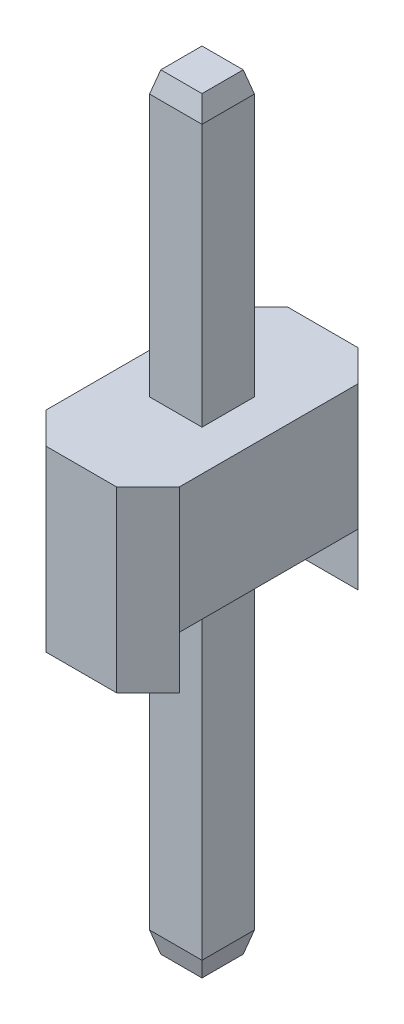
ISO-10303-21;
HEADER;
FILE_DESCRIPTION(('STEP AP214'),'2;1');
FILE_NAME('part.step','',(''),(''),'','','');
FILE_SCHEMA(('AUTOMOTIVE_DESIGN { 1 0 10303 214 1 1 1 1 }'));
ENDSEC;
DATA;
#1=APPLICATION_CONTEXT('core data for automotive mechanical design processes');
#2=APPLICATION_PROTOCOL_DEFINITION('international standard','automotive_design',2000,#1);
#3=PRODUCT_CONTEXT('',#1,'mechanical');
#4=PRODUCT('Part','Part','',(#3));
#5=PRODUCT_RELATED_PRODUCT_CATEGORY('part','',(#4));
#6=PRODUCT_DEFINITION_FORMATION('','',#4);
#7=PRODUCT_DEFINITION_CONTEXT('part definition',#1,'design');
#8=PRODUCT_DEFINITION('design','',#6,#7);
#9=PRODUCT_DEFINITION_SHAPE('','',#8);
#10=(LENGTH_UNIT() NAMED_UNIT(*) SI_UNIT(.MILLI.,.METRE.));
#11=(NAMED_UNIT(*) PLANE_ANGLE_UNIT() SI_UNIT($,.RADIAN.));
#12=(NAMED_UNIT(*) SI_UNIT($,.STERADIAN.) SOLID_ANGLE_UNIT());
#13=UNCERTAINTY_MEASURE_WITH_UNIT(LENGTH_MEASURE(1.E-05),#10,'distance_accuracy_value','');
#14=(GEOMETRIC_REPRESENTATION_CONTEXT(3) GLOBAL_UNCERTAINTY_ASSIGNED_CONTEXT((#13)) GLOBAL_UNIT_ASSIGNED_CONTEXT((#10,
#11,#12)) REPRESENTATION_CONTEXT('',''));
#15=CARTESIAN_POINT('',(0.,0.,0.));
#16=DIRECTION('',(0.,0.,1.));
#17=DIRECTION('',(1.,0.,0.));
#18=AXIS2_PLACEMENT_3D('',#15,#16,#17);
#19=CARTESIAN_POINT('',(0.25,-2.7,0.25));
#20=DIRECTION('',(0.,0.258819045102985,-0.965925826288944));
#21=DIRECTION('',(0.,0.965925826288944,0.258819045102985));
#22=AXIS2_PLACEMENT_3D('',#19,#20,#21);
#23=PLANE('',#22);
#24=DIRECTION('',(-1.,0.,0.));
#25=VECTOR('',#24,1.);
#26=CARTESIAN_POINT('',(0.25,-2.7,0.25));
#27=LINE('',#26,#25);
#28=CARTESIAN_POINT('',(0.25,-2.7,0.25));
#29=VERTEX_POINT('',#28);
#30=CARTESIAN_POINT('',(-0.25,-2.7,0.25));
#31=VERTEX_POINT('',#30);
#32=EDGE_CURVE('E168',#29,#31,#27,.T.);
#33=ORIENTED_EDGE('',*,*,#32,.T.);
#34=DIRECTION('',(0.250562807086243,-0.935113126531138,-0.250562807084814));
#35=VECTOR('',#34,1.);
#36=CARTESIAN_POINT('',(-0.25,-2.7,0.25));
#37=LINE('',#36,#35);
#38=CARTESIAN_POINT('',(-0.196410161513847,-2.89999999999994,0.196410161513924));
#39=VERTEX_POINT('',#38);
#40=EDGE_CURVE('E20',#31,#39,#37,.T.);
#41=ORIENTED_EDGE('',*,*,#40,.T.);
#42=DIRECTION('',(1.,0.,0.));
#43=VECTOR('',#42,1.);
#44=CARTESIAN_POINT('',(0.,-2.9,0.196410161514));
#45=LINE('',#44,#43);
#46=CARTESIAN_POINT('',(0.196410161513924,-2.89999999999996,0.196410161513924));
#47=VERTEX_POINT('',#46);
#48=EDGE_CURVE('E165',#39,#47,#45,.T.);
#49=ORIENTED_EDGE('',*,*,#48,.T.);
#50=DIRECTION('',(0.250562807086243,0.935113126531138,0.250562807084814));
#51=VECTOR('',#50,1.);
#52=CARTESIAN_POINT('',(0.196410161513694,-2.89999999999992,0.196410161514));
#53=LINE('',#52,#51);
#54=EDGE_CURVE('E186',#47,#29,#53,.T.);
#55=ORIENTED_EDGE('',*,*,#54,.T.);
#56=EDGE_LOOP('',(#33,#41,#49,#55));
#57=FACE_BOUND('',#56,.T.);
#58=ADVANCED_FACE('F17',(#57),#23,.F.);
#59=CARTESIAN_POINT('',(-0.25,-2.7,0.25));
#60=DIRECTION('',(0.965925826288944,0.258819045102985,0.));
#61=DIRECTION('',(-0.258819045102985,0.965925826288944,0.));
#62=AXIS2_PLACEMENT_3D('',#59,#60,#61);
#63=PLANE('',#62);
#64=DIRECTION('',(0.,0.,1.));
#65=VECTOR('',#64,1.);
#66=CARTESIAN_POINT('',(-0.196410161514,-2.9,0.));
#67=LINE('',#66,#65);
#68=CARTESIAN_POINT('',(-0.196410161513847,-2.89999999999994,-0.196410161513924));
#69=VERTEX_POINT('',#68);
#70=EDGE_CURVE('E173',#69,#39,#67,.T.);
#71=ORIENTED_EDGE('',*,*,#70,.T.);
#72=ORIENTED_EDGE('',*,*,#40,.F.);
#73=DIRECTION('',(0.,0.,-1.));
#74=VECTOR('',#73,1.);
#75=CARTESIAN_POINT('',(-0.25,-2.7,0.25));
#76=LINE('',#75,#74);
#77=CARTESIAN_POINT('',(-0.25,-2.7,-0.25));
#78=VERTEX_POINT('',#77);
#79=EDGE_CURVE('E198',#31,#78,#76,.T.);
#80=ORIENTED_EDGE('',*,*,#79,.T.);
#81=DIRECTION('',(0.250562807084814,-0.935113126531138,0.250562807086243));
#82=VECTOR('',#81,1.);
#83=CARTESIAN_POINT('',(-0.25,-2.7,-0.25));
#84=LINE('',#83,#82);
#85=EDGE_CURVE('E183',#78,#69,#84,.T.);
#86=ORIENTED_EDGE('',*,*,#85,.T.);
#87=EDGE_LOOP('',(#71,#72,#80,#86));
#88=FACE_BOUND('',#87,.T.);
#89=ADVANCED_FACE('F182',(#88),#63,.F.);
#90=CARTESIAN_POINT('',(0.,-2.9,0.));
#91=DIRECTION('',(0.,1.,0.));
#92=DIRECTION('',(0.,0.,1.));
#93=AXIS2_PLACEMENT_3D('',#90,#91,#92);
#94=PLANE('',#93);
#95=ORIENTED_EDGE('',*,*,#70,.F.);
#96=DIRECTION('',(1.,0.,0.));
#97=VECTOR('',#96,1.);
#98=CARTESIAN_POINT('',(0.25,-2.89999999999992,-0.196410161513694));
#99=LINE('',#98,#97);
#100=CARTESIAN_POINT('',(0.196410161513924,-2.89999999999996,-0.196410161513924));
#101=VERTEX_POINT('',#100);
#102=EDGE_CURVE('E201',#69,#101,#99,.T.);
#103=ORIENTED_EDGE('',*,*,#102,.T.);
#104=DIRECTION('',(0.,0.,1.));
#105=VECTOR('',#104,1.);
#106=CARTESIAN_POINT('',(0.196410161513694,-2.89999999999992,0.25));
#107=LINE('',#106,#105);
#108=EDGE_CURVE('E179',#101,#47,#107,.T.);
#109=ORIENTED_EDGE('',*,*,#108,.T.);
#110=ORIENTED_EDGE('',*,*,#48,.F.);
#111=EDGE_LOOP('',(#95,#103,#109,#110));
#112=FACE_BOUND('',#111,.T.);
#113=ADVANCED_FACE('F176',(#112),#94,.F.);
#114=CARTESIAN_POINT('',(0.25,-2.7,0.25));
#115=DIRECTION('',(-0.965925826288944,0.258819045102985,0.));
#116=DIRECTION('',(-0.258819045102985,-0.965925826288944,0.));
#117=AXIS2_PLACEMENT_3D('',#114,#115,#116);
#118=PLANE('',#117);
#119=ORIENTED_EDGE('',*,*,#108,.F.);
#120=DIRECTION('',(0.250562807084814,0.935113126531138,-0.250562807086243));
#121=VECTOR('',#120,1.);
#122=CARTESIAN_POINT('',(0.196410161514,-2.89999999999992,-0.196410161513694));
#123=LINE('',#122,#121);
#124=CARTESIAN_POINT('',(0.25,-2.7,-0.25));
#125=VERTEX_POINT('',#124);
#126=EDGE_CURVE('E203',#101,#125,#123,.T.);
#127=ORIENTED_EDGE('',*,*,#126,.T.);
#128=DIRECTION('',(0.,0.,1.));
#129=VECTOR('',#128,1.);
#130=CARTESIAN_POINT('',(0.25,-2.7,0.25));
#131=LINE('',#130,#129);
#132=EDGE_CURVE('E208',#125,#29,#131,.T.);
#133=ORIENTED_EDGE('',*,*,#132,.T.);
#134=ORIENTED_EDGE('',*,*,#54,.F.);
#135=EDGE_LOOP('',(#119,#127,#133,#134));
#136=FACE_BOUND('',#135,.T.);
#137=ADVANCED_FACE('F684',(#136),#118,.F.);
#138=CARTESIAN_POINT('',(0.25,-10.90710678118,0.25));
#139=DIRECTION('',(0.,0.,-1.));
#140=DIRECTION('',(-1.,0.,0.));
#141=AXIS2_PLACEMENT_3D('',#138,#139,#140);
#142=PLANE('',#141);
#143=ORIENTED_EDGE('',*,*,#32,.F.);
#144=DIRECTION('',(0.,1.,0.));
#145=VECTOR('',#144,1.);
#146=CARTESIAN_POINT('',(0.25,-10.90710678118,0.25));
#147=LINE('',#146,#145);
#148=CARTESIAN_POINT('',(0.25,0.5,0.25));
#149=VERTEX_POINT('',#148);
#150=EDGE_CURVE('E211',#29,#149,#147,.T.);
#151=ORIENTED_EDGE('',*,*,#150,.T.);
#152=DIRECTION('',(-1.,0.,0.));
#153=VECTOR('',#152,1.);
#154=CARTESIAN_POINT('',(0.25,0.5,0.25));
#155=LINE('',#154,#153);
#156=CARTESIAN_POINT('',(-0.25,0.5,0.25));
#157=VERTEX_POINT('',#156);
#158=EDGE_CURVE('E188',#157,#149,#155,.F.);
#159=ORIENTED_EDGE('',*,*,#158,.F.);
#160=DIRECTION('',(0.,1.,0.));
#161=VECTOR('',#160,1.);
#162=CARTESIAN_POINT('',(-0.25,-10.90710678118,0.25));
#163=LINE('',#162,#161);
#164=EDGE_CURVE('E195',#157,#31,#163,.F.);
#165=ORIENTED_EDGE('',*,*,#164,.T.);
#166=EDGE_LOOP('',(#143,#151,#159,#165));
#167=FACE_BOUND('',#166,.T.);
#168=ADVANCED_FACE('F674',(#167),#142,.F.);
#169=CARTESIAN_POINT('',(-0.25,-10.90710678118,0.25));
#170=DIRECTION('',(1.,0.,0.));
#171=DIRECTION('',(0.,0.,-1.));
#172=AXIS2_PLACEMENT_3D('',#169,#170,#171);
#173=PLANE('',#172);
#174=ORIENTED_EDGE('',*,*,#79,.F.);
#175=ORIENTED_EDGE('',*,*,#164,.F.);
#176=DIRECTION('',(0.,0.,-1.));
#177=VECTOR('',#176,1.);
#178=CARTESIAN_POINT('',(-0.25,0.5,0.25));
#179=LINE('',#178,#177);
#180=CARTESIAN_POINT('',(-0.25,0.5,-0.25));
#181=VERTEX_POINT('',#180);
#182=EDGE_CURVE('E192',#181,#157,#179,.F.);
#183=ORIENTED_EDGE('',*,*,#182,.F.);
#184=DIRECTION('',(0.,1.,0.));
#185=VECTOR('',#184,1.);
#186=CARTESIAN_POINT('',(-0.25,-10.90710678118,-0.25));
#187=LINE('',#186,#185);
#188=EDGE_CURVE('E226',#181,#78,#187,.F.);
#189=ORIENTED_EDGE('',*,*,#188,.T.);
#190=EDGE_LOOP('',(#174,#175,#183,#189));
#191=FACE_BOUND('',#190,.T.);
#192=ADVANCED_FACE('F664',(#191),#173,.F.);
#193=CARTESIAN_POINT('',(0.25,-2.7,-0.25));
#194=DIRECTION('',(0.,0.258819045102985,0.965925826288944));
#195=DIRECTION('',(0.,-0.965925826288944,0.258819045102985));
#196=AXIS2_PLACEMENT_3D('',#193,#194,#195);
#197=PLANE('',#196);
#198=ORIENTED_EDGE('',*,*,#102,.F.);
#199=ORIENTED_EDGE('',*,*,#85,.F.);
#200=DIRECTION('',(1.,0.,0.));
#201=VECTOR('',#200,1.);
#202=CARTESIAN_POINT('',(0.25,-2.7,-0.25));
#203=LINE('',#202,#201);
#204=EDGE_CURVE('E229',#78,#125,#203,.T.);
#205=ORIENTED_EDGE('',*,*,#204,.T.);
#206=ORIENTED_EDGE('',*,*,#126,.F.);
#207=EDGE_LOOP('',(#198,#199,#205,#206));
#208=FACE_BOUND('',#207,.T.);
#209=ADVANCED_FACE('F654',(#208),#197,.F.);
#210=CARTESIAN_POINT('',(0.25,-10.90710678118,0.25));
#211=DIRECTION('',(-1.,0.,0.));
#212=DIRECTION('',(0.,0.,1.));
#213=AXIS2_PLACEMENT_3D('',#210,#211,#212);
#214=PLANE('',#213);
#215=ORIENTED_EDGE('',*,*,#132,.F.);
#216=DIRECTION('',(0.,1.,0.));
#217=VECTOR('',#216,1.);
#218=CARTESIAN_POINT('',(0.25,-10.90710678118,-0.25));
#219=LINE('',#218,#217);
#220=CARTESIAN_POINT('',(0.25,0.5,-0.25));
#221=VERTEX_POINT('',#220);
#222=EDGE_CURVE('E232',#125,#221,#219,.T.);
#223=ORIENTED_EDGE('',*,*,#222,.T.);
#224=DIRECTION('',(0.,0.,1.));
#225=VECTOR('',#224,1.);
#226=CARTESIAN_POINT('',(0.25,0.5,0.25));
#227=LINE('',#226,#225);
#228=EDGE_CURVE('E206',#149,#221,#227,.F.);
#229=ORIENTED_EDGE('',*,*,#228,.F.);
#230=ORIENTED_EDGE('',*,*,#150,.F.);
#231=EDGE_LOOP('',(#215,#223,#229,#230));
#232=FACE_BOUND('',#231,.T.);
#233=ADVANCED_FACE('F412',(#232),#214,.F.);
#234=CARTESIAN_POINT('',(-0.196410161514,4.4,0.));
#235=DIRECTION('',(-0.965925826288944,0.258819045102985,0.));
#236=DIRECTION('',(-0.258819045102985,-0.965925826288944,0.));
#237=AXIS2_PLACEMENT_3D('',#234,#235,#236);
#238=PLANE('',#237);
#239=DIRECTION('',(-0.250562807084814,-0.935113126531138,0.250562807086243));
#240=VECTOR('',#239,1.);
#241=CARTESIAN_POINT('',(-0.196410161514,4.4,0.196410161514));
#242=LINE('',#241,#240);
#243=CARTESIAN_POINT('',(-0.196410161514,4.4,0.196410161514));
#244=VERTEX_POINT('',#243);
#245=CARTESIAN_POINT('',(-0.250000000000153,4.20000000000005,0.250000000000038));
#246=VERTEX_POINT('',#245);
#247=EDGE_CURVE('E237',#244,#246,#242,.T.);
#248=ORIENTED_EDGE('',*,*,#247,.F.);
#249=DIRECTION('',(0.,0.,1.));
#250=VECTOR('',#249,1.);
#251=CARTESIAN_POINT('',(-0.196410161514,4.4,0.));
#252=LINE('',#251,#250);
#253=CARTESIAN_POINT('',(-0.196410161514,4.4,-0.196410161514));
#254=VERTEX_POINT('',#253);
#255=EDGE_CURVE('E235',#254,#244,#252,.T.);
#256=ORIENTED_EDGE('',*,*,#255,.F.);
#257=DIRECTION('',(0.250562807084814,0.935113126531138,0.250562807086243));
#258=VECTOR('',#257,1.);
#259=CARTESIAN_POINT('',(-0.25,4.20000000000008,-0.250000000000306));
#260=LINE('',#259,#258);
#261=CARTESIAN_POINT('',(-0.250000000000153,4.20000000000006,-0.250000000000076));
#262=VERTEX_POINT('',#261);
#263=EDGE_CURVE('E242',#262,#254,#260,.T.);
#264=ORIENTED_EDGE('',*,*,#263,.F.);
#265=DIRECTION('',(0.,0.,-1.));
#266=VECTOR('',#265,1.);
#267=CARTESIAN_POINT('',(-0.25,4.2,-0.25));
#268=LINE('',#267,#266);
#269=EDGE_CURVE('E249',#262,#246,#268,.F.);
#270=ORIENTED_EDGE('',*,*,#269,.T.);
#271=EDGE_LOOP('',(#248,#256,#264,#270));
#272=FACE_BOUND('',#271,.T.);
#273=ADVANCED_FACE('F404',(#272),#238,.T.);
#274=CARTESIAN_POINT('',(0.,0.,0.));
#275=DIRECTION('',(0.,-1.,0.));
#276=DIRECTION('',(0.,0.,-1.));
#277=AXIS2_PLACEMENT_3D('',#274,#275,#276);
#278=PLANE('',#277);
#279=DIRECTION('',(1.,0.,0.));
#280=VECTOR('',#279,1.);
#281=CARTESIAN_POINT('',(0.635,0.,-1.15));
#282=LINE('',#281,#280);
#283=CARTESIAN_POINT('',(-0.335,0.,-1.15));
#284=VERTEX_POINT('',#283);
#285=CARTESIAN_POINT('',(0.335,0.,-1.15));
#286=VERTEX_POINT('',#285);
#287=EDGE_CURVE('E216',#284,#286,#282,.T.);
#288=ORIENTED_EDGE('',*,*,#287,.T.);
#289=DIRECTION('',(0.707106781186548,0.,0.707106781186548));
#290=VECTOR('',#289,1.);
#291=CARTESIAN_POINT('',(0.335,0.,-1.15));
#292=LINE('',#291,#290);
#293=CARTESIAN_POINT('',(0.635,0.,-0.85));
#294=VERTEX_POINT('',#293);
#295=EDGE_CURVE('E266',#286,#294,#292,.T.);
#296=ORIENTED_EDGE('',*,*,#295,.T.);
#297=DIRECTION('',(-1.,0.,0.));
#298=VECTOR('',#297,1.);
#299=CARTESIAN_POINT('',(-0.635,0.,-0.85));
#300=LINE('',#299,#298);
#301=CARTESIAN_POINT('',(-0.635,0.,-0.85));
#302=VERTEX_POINT('',#301);
#303=EDGE_CURVE('E222',#294,#302,#300,.T.);
#304=ORIENTED_EDGE('',*,*,#303,.T.);
#305=DIRECTION('',(0.707106781186548,0.,-0.707106781186548));
#306=VECTOR('',#305,1.);
#307=CARTESIAN_POINT('',(-0.635,0.,-0.85));
#308=LINE('',#307,#306);
#309=EDGE_CURVE('E278',#302,#284,#308,.T.);
#310=ORIENTED_EDGE('',*,*,#309,.T.);
#311=EDGE_LOOP('',(#288,#296,#304,#310));
#312=FACE_BOUND('',#311,.T.);
#313=ADVANCED_FACE('F402',(#312),#278,.T.);
#314=CARTESIAN_POINT('',(0.635,1.7,-1.15));
#315=DIRECTION('',(0.,0.,1.));
#316=DIRECTION('',(1.,0.,0.));
#317=AXIS2_PLACEMENT_3D('',#314,#315,#316);
#318=PLANE('',#317);
#319=DIRECTION('',(0.,1.,0.));
#320=VECTOR('',#319,1.);
#321=CARTESIAN_POINT('',(-0.335,1.7,-1.15));
#322=LINE('',#321,#320);
#323=CARTESIAN_POINT('',(-0.335,1.7,-1.15));
#324=VERTEX_POINT('',#323);
#325=EDGE_CURVE('E281',#284,#324,#322,.T.);
#326=ORIENTED_EDGE('',*,*,#325,.T.);
#327=DIRECTION('',(1.,0.,0.));
#328=VECTOR('',#327,1.);
#329=CARTESIAN_POINT('',(0.635,1.7,-1.15));
#330=LINE('',#329,#328);
#331=CARTESIAN_POINT('',(0.335,1.7,-1.15));
#332=VERTEX_POINT('',#331);
#333=EDGE_CURVE('E214',#332,#324,#330,.F.);
#334=ORIENTED_EDGE('',*,*,#333,.F.);
#335=DIRECTION('',(0.,1.,0.));
#336=VECTOR('',#335,1.);
#337=CARTESIAN_POINT('',(0.335,1.7,-1.15));
#338=LINE('',#337,#336);
#339=EDGE_CURVE('E263',#332,#286,#338,.F.);
#340=ORIENTED_EDGE('',*,*,#339,.T.);
#341=ORIENTED_EDGE('',*,*,#287,.F.);
#342=EDGE_LOOP('',(#326,#334,#340,#341));
#343=FACE_BOUND('',#342,.T.);
#344=ADVANCED_FACE('F400',(#343),#318,.F.);
#345=CARTESIAN_POINT('',(0.635,1.7,1.15));
#346=DIRECTION('',(0.,0.,-1.));
#347=DIRECTION('',(-1.,0.,0.));
#348=AXIS2_PLACEMENT_3D('',#345,#346,#347);
#349=PLANE('',#348);
#350=DIRECTION('',(0.,1.,0.));
#351=VECTOR('',#350,1.);
#352=CARTESIAN_POINT('',(0.335,1.7,1.15));
#353=LINE('',#352,#351);
#354=CARTESIAN_POINT('',(0.335,0.,1.15));
#355=VERTEX_POINT('',#354);
#356=CARTESIAN_POINT('',(0.335,1.7,1.15));
#357=VERTEX_POINT('',#356);
#358=EDGE_CURVE('E258',#355,#357,#353,.T.);
#359=ORIENTED_EDGE('',*,*,#358,.T.);
#360=DIRECTION('',(-1.,0.,0.));
#361=VECTOR('',#360,1.);
#362=CARTESIAN_POINT('',(0.635,1.7,1.15));
#363=LINE('',#362,#361);
#364=CARTESIAN_POINT('',(-0.335,1.7,1.15));
#365=VERTEX_POINT('',#364);
#366=EDGE_CURVE('E218',#365,#357,#363,.F.);
#367=ORIENTED_EDGE('',*,*,#366,.F.);
#368=DIRECTION('',(0.,1.,0.));
#369=VECTOR('',#368,1.);
#370=CARTESIAN_POINT('',(-0.335,1.7,1.15));
#371=LINE('',#370,#369);
#372=CARTESIAN_POINT('',(-0.335,0.,1.15));
#373=VERTEX_POINT('',#372);
#374=EDGE_CURVE('E286',#365,#373,#371,.F.);
#375=ORIENTED_EDGE('',*,*,#374,.T.);
#376=DIRECTION('',(1.,0.,0.));
#377=VECTOR('',#376,1.);
#378=CARTESIAN_POINT('',(0.,0.,1.15));
#379=LINE('',#378,#377);
#380=EDGE_CURVE('E220',#355,#373,#379,.F.);
#381=ORIENTED_EDGE('',*,*,#380,.F.);
#382=EDGE_LOOP('',(#359,#367,#375,#381));
#383=FACE_BOUND('',#382,.T.);
#384=ADVANCED_FACE('F384',(#383),#349,.F.);
#385=CARTESIAN_POINT('',(0.,0.,0.));
#386=DIRECTION('',(0.,-1.,0.));
#387=DIRECTION('',(0.,0.,-1.));
#388=AXIS2_PLACEMENT_3D('',#385,#386,#387);
#389=PLANE('',#388);
#390=ORIENTED_EDGE('',*,*,#380,.T.);
#391=DIRECTION('',(-0.707106781186548,0.,-0.707106781186548));
#392=VECTOR('',#391,1.);
#393=CARTESIAN_POINT('',(-0.335,0.,1.15));
#394=LINE('',#393,#392);
#395=CARTESIAN_POINT('',(-0.635,0.,0.85));
#396=VERTEX_POINT('',#395);
#397=EDGE_CURVE('E289',#373,#396,#394,.T.);
#398=ORIENTED_EDGE('',*,*,#397,.T.);
#399=DIRECTION('',(1.,0.,0.));
#400=VECTOR('',#399,1.);
#401=CARTESIAN_POINT('',(-0.635,0.,0.85));
#402=LINE('',#401,#400);
#403=CARTESIAN_POINT('',(0.635,0.,0.85));
#404=VERTEX_POINT('',#403);
#405=EDGE_CURVE('E224',#396,#404,#402,.T.);
#406=ORIENTED_EDGE('',*,*,#405,.T.);
#407=DIRECTION('',(-0.707106781186548,0.,0.707106781186548));
#408=VECTOR('',#407,1.);
#409=CARTESIAN_POINT('',(0.635,0.,0.85));
#410=LINE('',#409,#408);
#411=EDGE_CURVE('E255',#404,#355,#410,.T.);
#412=ORIENTED_EDGE('',*,*,#411,.T.);
#413=EDGE_LOOP('',(#390,#398,#406,#412));
#414=FACE_BOUND('',#413,.T.);
#415=ADVANCED_FACE('F477',(#414),#389,.T.);
#416=CARTESIAN_POINT('',(-0.635,0.5,-0.85));
#417=DIRECTION('',(0.,0.,-1.));
#418=DIRECTION('',(-1.,0.,0.));
#419=AXIS2_PLACEMENT_3D('',#416,#417,#418);
#420=PLANE('',#419);
#421=DIRECTION('',(0.,1.,0.));
#422=VECTOR('',#421,1.);
#423=CARTESIAN_POINT('',(0.635,1.7,-0.85));
#424=LINE('',#423,#422);
#425=CARTESIAN_POINT('',(0.635,0.5,-0.85));
#426=VERTEX_POINT('',#425);
#427=EDGE_CURVE('E269',#294,#426,#424,.T.);
#428=ORIENTED_EDGE('',*,*,#427,.T.);
#429=DIRECTION('',(1.,0.,0.));
#430=VECTOR('',#429,1.);
#431=CARTESIAN_POINT('',(0.,0.5,-0.85));
#432=LINE('',#431,#430);
#433=CARTESIAN_POINT('',(-0.635,0.5,-0.85));
#434=VERTEX_POINT('',#433);
#435=EDGE_CURVE('E298',#434,#426,#432,.T.);
#436=ORIENTED_EDGE('',*,*,#435,.F.);
#437=DIRECTION('',(0.,1.,0.));
#438=VECTOR('',#437,1.);
#439=CARTESIAN_POINT('',(-0.635,1.7,-0.85));
#440=LINE('',#439,#438);
#441=EDGE_CURVE('E275',#434,#302,#440,.F.);
#442=ORIENTED_EDGE('',*,*,#441,.T.);
#443=ORIENTED_EDGE('',*,*,#303,.F.);
#444=EDGE_LOOP('',(#428,#436,#442,#443));
#445=FACE_BOUND('',#444,.T.);
#446=ADVANCED_FACE('F372',(#445),#420,.F.);
#447=CARTESIAN_POINT('',(-0.635,0.5,0.85));
#448=DIRECTION('',(0.,0.,1.));
#449=DIRECTION('',(1.,0.,0.));
#450=AXIS2_PLACEMENT_3D('',#447,#448,#449);
#451=PLANE('',#450);
#452=DIRECTION('',(0.,1.,0.));
#453=VECTOR('',#452,1.);
#454=CARTESIAN_POINT('',(-0.635,1.7,0.85));
#455=LINE('',#454,#453);
#456=CARTESIAN_POINT('',(-0.635,0.5,0.85));
#457=VERTEX_POINT('',#456);
#458=EDGE_CURVE('E292',#396,#457,#455,.T.);
#459=ORIENTED_EDGE('',*,*,#458,.T.);
#460=DIRECTION('',(1.,0.,0.));
#461=VECTOR('',#460,1.);
#462=CARTESIAN_POINT('',(0.,0.5,0.85));
#463=LINE('',#462,#461);
#464=CARTESIAN_POINT('',(0.635,0.5,0.85));
#465=VERTEX_POINT('',#464);
#466=EDGE_CURVE('E300',#465,#457,#463,.F.);
#467=ORIENTED_EDGE('',*,*,#466,.F.);
#468=DIRECTION('',(0.,1.,0.));
#469=VECTOR('',#468,1.);
#470=CARTESIAN_POINT('',(0.635,1.7,0.85));
#471=LINE('',#470,#469);
#472=EDGE_CURVE('E252',#465,#404,#471,.F.);
#473=ORIENTED_EDGE('',*,*,#472,.T.);
#474=ORIENTED_EDGE('',*,*,#405,.F.);
#475=EDGE_LOOP('',(#459,#467,#473,#474));
#476=FACE_BOUND('',#475,.T.);
#477=ADVANCED_FACE('F470',(#476),#451,.F.);
#478=CARTESIAN_POINT('',(0.25,-10.90710678118,-0.25));
#479=DIRECTION('',(0.,0.,1.));
#480=DIRECTION('',(1.,0.,0.));
#481=AXIS2_PLACEMENT_3D('',#478,#479,#480);
#482=PLANE('',#481);
#483=ORIENTED_EDGE('',*,*,#204,.F.);
#484=ORIENTED_EDGE('',*,*,#188,.F.);
#485=DIRECTION('',(1.,0.,0.));
#486=VECTOR('',#485,1.);
#487=CARTESIAN_POINT('',(0.,0.5,-0.25));
#488=LINE('',#487,#486);
#489=EDGE_CURVE('E302',#221,#181,#488,.F.);
#490=ORIENTED_EDGE('',*,*,#489,.F.);
#491=ORIENTED_EDGE('',*,*,#222,.F.);
#492=EDGE_LOOP('',(#483,#484,#490,#491));
#493=FACE_BOUND('',#492,.T.);
#494=ADVANCED_FACE('F466',(#493),#482,.F.);
#495=CARTESIAN_POINT('',(0.,4.4,0.));
#496=DIRECTION('',(0.,1.,0.));
#497=DIRECTION('',(0.,0.,1.));
#498=AXIS2_PLACEMENT_3D('',#495,#496,#497);
#499=PLANE('',#498);
#500=DIRECTION('',(0.,0.,1.));
#501=VECTOR('',#500,1.);
#502=CARTESIAN_POINT('',(0.196410161514,4.4,0.));
#503=LINE('',#502,#501);
#504=CARTESIAN_POINT('',(0.196410161514,4.4,-0.196410161514));
#505=VERTEX_POINT('',#504);
#506=CARTESIAN_POINT('',(0.196410161514,4.4,0.196410161514));
#507=VERTEX_POINT('',#506);
#508=EDGE_CURVE('E315',#505,#507,#503,.T.);
#509=ORIENTED_EDGE('',*,*,#508,.F.);
#510=DIRECTION('',(1.,0.,0.));
#511=VECTOR('',#510,1.);
#512=CARTESIAN_POINT('',(0.,4.4,-0.196410161514));
#513=LINE('',#512,#511);
#514=EDGE_CURVE('E244',#254,#505,#513,.T.);
#515=ORIENTED_EDGE('',*,*,#514,.F.);
#516=ORIENTED_EDGE('',*,*,#255,.T.);
#517=DIRECTION('',(1.,0.,0.));
#518=VECTOR('',#517,1.);
#519=CARTESIAN_POINT('',(0.,4.4,0.196410161514));
#520=LINE('',#519,#518);
#521=EDGE_CURVE('E239',#507,#244,#520,.F.);
#522=ORIENTED_EDGE('',*,*,#521,.F.);
#523=EDGE_LOOP('',(#509,#515,#516,#522));
#524=FACE_BOUND('',#523,.T.);
#525=ADVANCED_FACE('F462',(#524),#499,.T.);
#526=CARTESIAN_POINT('',(0.,4.4,0.196410161514));
#527=DIRECTION('',(0.,0.258819045102985,0.965925826288944));
#528=DIRECTION('',(0.,-0.965925826288944,0.258819045102985));
#529=AXIS2_PLACEMENT_3D('',#526,#527,#528);
#530=PLANE('',#529);
#531=DIRECTION('',(0.250562807086243,-0.935113126531138,0.250562807084814));
#532=VECTOR('',#531,1.);
#533=CARTESIAN_POINT('',(0.196410161514,4.4,0.196410161514));
#534=LINE('',#533,#532);
#535=CARTESIAN_POINT('',(0.250000000000038,4.20000000000005,0.250000000000153));
#536=VERTEX_POINT('',#535);
#537=EDGE_CURVE('E317',#507,#536,#534,.T.);
#538=ORIENTED_EDGE('',*,*,#537,.F.);
#539=ORIENTED_EDGE('',*,*,#521,.T.);
#540=ORIENTED_EDGE('',*,*,#247,.T.);
#541=DIRECTION('',(-1.,0.,0.));
#542=VECTOR('',#541,1.);
#543=CARTESIAN_POINT('',(-0.25,4.2,0.25));
#544=LINE('',#543,#542);
#545=EDGE_CURVE('E309',#246,#536,#544,.F.);
#546=ORIENTED_EDGE('',*,*,#545,.T.);
#547=EDGE_LOOP('',(#538,#539,#540,#546));
#548=FACE_BOUND('',#547,.T.);
#549=ADVANCED_FACE('F458',(#548),#530,.T.);
#550=CARTESIAN_POINT('',(0.,4.4,-0.196410161514));
#551=DIRECTION('',(0.,0.258819045102985,-0.965925826288944));
#552=DIRECTION('',(0.,0.965925826288944,0.258819045102985));
#553=AXIS2_PLACEMENT_3D('',#550,#551,#552);
#554=PLANE('',#553);
#555=ORIENTED_EDGE('',*,*,#263,.T.);
#556=ORIENTED_EDGE('',*,*,#514,.T.);
#557=DIRECTION('',(-0.250562807086242,0.935113126531138,0.250562807084814));
#558=VECTOR('',#557,1.);
#559=CARTESIAN_POINT('',(0.250000000000306,4.20000000000008,-0.25));
#560=LINE('',#559,#558);
#561=CARTESIAN_POINT('',(0.250000000000076,4.20000000000006,-0.250000000000153));
#562=VERTEX_POINT('',#561);
#563=EDGE_CURVE('E312',#562,#505,#560,.T.);
#564=ORIENTED_EDGE('',*,*,#563,.F.);
#565=DIRECTION('',(1.,0.,0.));
#566=VECTOR('',#565,1.);
#567=CARTESIAN_POINT('',(-0.25,4.2,-0.25));
#568=LINE('',#567,#566);
#569=EDGE_CURVE('E321',#562,#262,#568,.F.);
#570=ORIENTED_EDGE('',*,*,#569,.T.);
#571=EDGE_LOOP('',(#555,#556,#564,#570));
#572=FACE_BOUND('',#571,.T.);
#573=ADVANCED_FACE('F454',(#572),#554,.T.);
#574=CARTESIAN_POINT('',(-0.25,4.4,-0.25));
#575=DIRECTION('',(1.,0.,0.));
#576=DIRECTION('',(0.,0.,-1.));
#577=AXIS2_PLACEMENT_3D('',#574,#575,#576);
#578=PLANE('',#577);
#579=ORIENTED_EDGE('',*,*,#269,.F.);
#580=DIRECTION('',(0.,1.,0.));
#581=VECTOR('',#580,1.);
#582=CARTESIAN_POINT('',(-0.25,4.4,-0.25));
#583=LINE('',#582,#581);
#584=CARTESIAN_POINT('',(-0.25,1.7,-0.25));
#585=VERTEX_POINT('',#584);
#586=EDGE_CURVE('E324',#262,#585,#583,.F.);
#587=ORIENTED_EDGE('',*,*,#586,.T.);
#588=DIRECTION('',(0.,0.,-1.));
#589=VECTOR('',#588,1.);
#590=CARTESIAN_POINT('',(-0.25,1.7,-0.25));
#591=LINE('',#590,#589);
#592=CARTESIAN_POINT('',(-0.25,1.7,0.25));
#593=VERTEX_POINT('',#592);
#594=EDGE_CURVE('E246',#593,#585,#591,.T.);
#595=ORIENTED_EDGE('',*,*,#594,.F.);
#596=DIRECTION('',(0.,1.,0.));
#597=VECTOR('',#596,1.);
#598=CARTESIAN_POINT('',(-0.25,4.4,0.25));
#599=LINE('',#598,#597);
#600=EDGE_CURVE('E306',#593,#246,#599,.T.);
#601=ORIENTED_EDGE('',*,*,#600,.T.);
#602=EDGE_LOOP('',(#579,#587,#595,#601));
#603=FACE_BOUND('',#602,.T.);
#604=ADVANCED_FACE('F451',(#603),#578,.F.);
#605=CARTESIAN_POINT('',(0.635,1.7,0.85));
#606=DIRECTION('',(-0.707106781186548,0.,-0.707106781186548));
#607=DIRECTION('',(-0.707106781186548,0.,0.707106781186548));
#608=AXIS2_PLACEMENT_3D('',#605,#606,#607);
#609=PLANE('',#608);
#610=ORIENTED_EDGE('',*,*,#358,.F.);
#611=ORIENTED_EDGE('',*,*,#411,.F.);
#612=ORIENTED_EDGE('',*,*,#472,.F.);
#613=DIRECTION('',(0.,1.,0.));
#614=VECTOR('',#613,1.);
#615=CARTESIAN_POINT('',(0.635,1.7,0.85));
#616=LINE('',#615,#614);
#617=CARTESIAN_POINT('',(0.635,1.7,0.85));
#618=VERTEX_POINT('',#617);
#619=EDGE_CURVE('E327',#465,#618,#616,.T.);
#620=ORIENTED_EDGE('',*,*,#619,.T.);
#621=DIRECTION('',(-0.707106781186548,0.,0.707106781186548));
#622=VECTOR('',#621,1.);
#623=CARTESIAN_POINT('',(0.635,1.7,0.85));
#624=LINE('',#623,#622);
#625=EDGE_CURVE('E261',#357,#618,#624,.F.);
#626=ORIENTED_EDGE('',*,*,#625,.F.);
#627=EDGE_LOOP('',(#610,#611,#612,#620,#626));
#628=FACE_BOUND('',#627,.T.);
#629=ADVANCED_FACE('F389',(#628),#609,.F.);
#630=CARTESIAN_POINT('',(0.335,1.7,-1.15));
#631=DIRECTION('',(-0.707106781186548,0.,0.707106781186548));
#632=DIRECTION('',(0.707106781186548,0.,0.707106781186548));
#633=AXIS2_PLACEMENT_3D('',#630,#631,#632);
#634=PLANE('',#633);
#635=DIRECTION('',(0.,1.,0.));
#636=VECTOR('',#635,1.);
#637=CARTESIAN_POINT('',(0.635,1.7,-0.85));
#638=LINE('',#637,#636);
#639=CARTESIAN_POINT('',(0.635,1.7,-0.85));
#640=VERTEX_POINT('',#639);
#641=EDGE_CURVE('E330',#640,#426,#638,.F.);
#642=ORIENTED_EDGE('',*,*,#641,.T.);
#643=ORIENTED_EDGE('',*,*,#427,.F.);
#644=ORIENTED_EDGE('',*,*,#295,.F.);
#645=ORIENTED_EDGE('',*,*,#339,.F.);
#646=DIRECTION('',(0.707106781186548,0.,0.707106781186548));
#647=VECTOR('',#646,1.);
#648=CARTESIAN_POINT('',(0.335,1.7,-1.15));
#649=LINE('',#648,#647);
#650=EDGE_CURVE('E272',#640,#332,#649,.F.);
#651=ORIENTED_EDGE('',*,*,#650,.F.);
#652=EDGE_LOOP('',(#642,#643,#644,#645,#651));
#653=FACE_BOUND('',#652,.T.);
#654=ADVANCED_FACE('F397',(#653),#634,.F.);
#655=CARTESIAN_POINT('',(-0.635,1.7,-0.85));
#656=DIRECTION('',(0.707106781186548,0.,0.707106781186548));
#657=DIRECTION('',(0.707106781186548,0.,-0.707106781186548));
#658=AXIS2_PLACEMENT_3D('',#655,#656,#657);
#659=PLANE('',#658);
#660=ORIENTED_EDGE('',*,*,#325,.F.);
#661=ORIENTED_EDGE('',*,*,#309,.F.);
#662=ORIENTED_EDGE('',*,*,#441,.F.);
#663=DIRECTION('',(0.,1.,0.));
#664=VECTOR('',#663,1.);
#665=CARTESIAN_POINT('',(-0.635,1.7,-0.85));
#666=LINE('',#665,#664);
#667=CARTESIAN_POINT('',(-0.635,1.7,-0.85));
#668=VERTEX_POINT('',#667);
#669=EDGE_CURVE('E336',#434,#668,#666,.T.);
#670=ORIENTED_EDGE('',*,*,#669,.T.);
#671=DIRECTION('',(0.707106781186548,0.,-0.707106781186548));
#672=VECTOR('',#671,1.);
#673=CARTESIAN_POINT('',(-0.635,1.7,-0.85));
#674=LINE('',#673,#672);
#675=EDGE_CURVE('E284',#324,#668,#674,.F.);
#676=ORIENTED_EDGE('',*,*,#675,.F.);
#677=EDGE_LOOP('',(#660,#661,#662,#670,#676));
#678=FACE_BOUND('',#677,.T.);
#679=ADVANCED_FACE('F369',(#678),#659,.F.);
#680=CARTESIAN_POINT('',(-0.335,1.7,1.15));
#681=DIRECTION('',(0.707106781186548,0.,-0.707106781186548));
#682=DIRECTION('',(-0.707106781186548,0.,-0.707106781186548));
#683=AXIS2_PLACEMENT_3D('',#680,#681,#682);
#684=PLANE('',#683);
#685=DIRECTION('',(0.,1.,0.));
#686=VECTOR('',#685,1.);
#687=CARTESIAN_POINT('',(-0.635,1.7,0.85));
#688=LINE('',#687,#686);
#689=CARTESIAN_POINT('',(-0.635,1.7,0.85));
#690=VERTEX_POINT('',#689);
#691=EDGE_CURVE('E339',#690,#457,#688,.F.);
#692=ORIENTED_EDGE('',*,*,#691,.T.);
#693=ORIENTED_EDGE('',*,*,#458,.F.);
#694=ORIENTED_EDGE('',*,*,#397,.F.);
#695=ORIENTED_EDGE('',*,*,#374,.F.);
#696=DIRECTION('',(-0.707106781186548,0.,-0.707106781186548));
#697=VECTOR('',#696,1.);
#698=CARTESIAN_POINT('',(-0.335,1.7,1.15));
#699=LINE('',#698,#697);
#700=EDGE_CURVE('E295',#690,#365,#699,.F.);
#701=ORIENTED_EDGE('',*,*,#700,.F.);
#702=EDGE_LOOP('',(#692,#693,#694,#695,#701));
#703=FACE_BOUND('',#702,.T.);
#704=ADVANCED_FACE('F380',(#703),#684,.F.);
#705=CARTESIAN_POINT('',(0.,0.5,0.));
#706=DIRECTION('',(0.,-1.,0.));
#707=DIRECTION('',(0.,0.,-1.));
#708=AXIS2_PLACEMENT_3D('',#705,#706,#707);
#709=PLANE('',#708);
#710=ORIENTED_EDGE('',*,*,#228,.T.);
#711=ORIENTED_EDGE('',*,*,#489,.T.);
#712=ORIENTED_EDGE('',*,*,#182,.T.);
#713=ORIENTED_EDGE('',*,*,#158,.T.);
#714=EDGE_LOOP('',(#710,#711,#712,#713));
#715=FACE_BOUND('',#714,.T.);
#716=DIRECTION('',(0.,0.,1.));
#717=VECTOR('',#716,1.);
#718=CARTESIAN_POINT('',(0.635,0.5,-1.15));
#719=LINE('',#718,#717);
#720=EDGE_CURVE('E333',#426,#465,#719,.T.);
#721=ORIENTED_EDGE('',*,*,#720,.T.);
#722=ORIENTED_EDGE('',*,*,#466,.T.);
#723=DIRECTION('',(0.,0.,-1.));
#724=VECTOR('',#723,1.);
#725=CARTESIAN_POINT('',(-0.635,0.5,-1.15));
#726=LINE('',#725,#724);
#727=EDGE_CURVE('E342',#457,#434,#726,.T.);
#728=ORIENTED_EDGE('',*,*,#727,.T.);
#729=ORIENTED_EDGE('',*,*,#435,.T.);
#730=EDGE_LOOP('',(#721,#722,#728,#729));
#731=FACE_BOUND('',#730,.T.);
#732=ADVANCED_FACE('F376',(#715,#731),#709,.T.);
#733=CARTESIAN_POINT('',(-0.25,4.4,0.25));
#734=DIRECTION('',(0.,0.,-1.));
#735=DIRECTION('',(-1.,0.,0.));
#736=AXIS2_PLACEMENT_3D('',#733,#734,#735);
#737=PLANE('',#736);
#738=ORIENTED_EDGE('',*,*,#545,.F.);
#739=ORIENTED_EDGE('',*,*,#600,.F.);
#740=DIRECTION('',(-1.,0.,0.));
#741=VECTOR('',#740,1.);
#742=CARTESIAN_POINT('',(-0.25,1.7,0.25));
#743=LINE('',#742,#741);
#744=CARTESIAN_POINT('',(0.25,1.7,0.25));
#745=VERTEX_POINT('',#744);
#746=EDGE_CURVE('E35',#745,#593,#743,.T.);
#747=ORIENTED_EDGE('',*,*,#746,.F.);
#748=DIRECTION('',(0.,1.,0.));
#749=VECTOR('',#748,1.);
#750=CARTESIAN_POINT('',(0.25,4.4,0.25));
#751=LINE('',#750,#749);
#752=EDGE_CURVE('E345',#745,#536,#751,.T.);
#753=ORIENTED_EDGE('',*,*,#752,.T.);
#754=EDGE_LOOP('',(#738,#739,#747,#753));
#755=FACE_BOUND('',#754,.T.);
#756=ADVANCED_FACE('F436',(#755),#737,.F.);
#757=CARTESIAN_POINT('',(0.196410161514,4.4,0.));
#758=DIRECTION('',(0.965925826288944,0.258819045102985,0.));
#759=DIRECTION('',(-0.258819045102985,0.965925826288944,0.));
#760=AXIS2_PLACEMENT_3D('',#757,#758,#759);
#761=PLANE('',#760);
#762=ORIENTED_EDGE('',*,*,#537,.T.);
#763=DIRECTION('',(0.,0.,1.));
#764=VECTOR('',#763,1.);
#765=CARTESIAN_POINT('',(0.25,4.2,-0.25));
#766=LINE('',#765,#764);
#767=EDGE_CURVE('E347',#536,#562,#766,.F.);
#768=ORIENTED_EDGE('',*,*,#767,.T.);
#769=ORIENTED_EDGE('',*,*,#563,.T.);
#770=ORIENTED_EDGE('',*,*,#508,.T.);
#771=EDGE_LOOP('',(#762,#768,#769,#770));
#772=FACE_BOUND('',#771,.T.);
#773=ADVANCED_FACE('F432',(#772),#761,.T.);
#774=CARTESIAN_POINT('',(-0.25,4.4,-0.25));
#775=DIRECTION('',(0.,0.,1.));
#776=DIRECTION('',(1.,0.,0.));
#777=AXIS2_PLACEMENT_3D('',#774,#775,#776);
#778=PLANE('',#777);
#779=ORIENTED_EDGE('',*,*,#569,.F.);
#780=DIRECTION('',(0.,1.,0.));
#781=VECTOR('',#780,1.);
#782=CARTESIAN_POINT('',(0.25,4.4,-0.25));
#783=LINE('',#782,#781);
#784=CARTESIAN_POINT('',(0.25,1.7,-0.25));
#785=VERTEX_POINT('',#784);
#786=EDGE_CURVE('E350',#562,#785,#783,.F.);
#787=ORIENTED_EDGE('',*,*,#786,.T.);
#788=DIRECTION('',(1.,0.,0.));
#789=VECTOR('',#788,1.);
#790=CARTESIAN_POINT('',(-0.25,1.7,-0.25));
#791=LINE('',#790,#789);
#792=EDGE_CURVE('E319',#585,#785,#791,.T.);
#793=ORIENTED_EDGE('',*,*,#792,.F.);
#794=ORIENTED_EDGE('',*,*,#586,.F.);
#795=EDGE_LOOP('',(#779,#787,#793,#794));
#796=FACE_BOUND('',#795,.T.);
#797=ADVANCED_FACE('F429',(#796),#778,.F.);
#798=CARTESIAN_POINT('',(0.635,1.7,-1.15));
#799=DIRECTION('',(-1.,0.,0.));
#800=DIRECTION('',(0.,0.,1.));
#801=AXIS2_PLACEMENT_3D('',#798,#799,#800);
#802=PLANE('',#801);
#803=ORIENTED_EDGE('',*,*,#641,.F.);
#804=DIRECTION('',(0.,0.,-1.));
#805=VECTOR('',#804,1.);
#806=CARTESIAN_POINT('',(0.635,1.7,0.));
#807=LINE('',#806,#805);
#808=EDGE_CURVE('E353',#640,#618,#807,.F.);
#809=ORIENTED_EDGE('',*,*,#808,.T.);
#810=ORIENTED_EDGE('',*,*,#619,.F.);
#811=ORIENTED_EDGE('',*,*,#720,.F.);
#812=EDGE_LOOP('',(#803,#809,#810,#811));
#813=FACE_BOUND('',#812,.T.);
#814=ADVANCED_FACE('F394',(#813),#802,.F.);
#815=CARTESIAN_POINT('',(-0.635,1.7,-1.15));
#816=DIRECTION('',(1.,0.,0.));
#817=DIRECTION('',(0.,0.,-1.));
#818=AXIS2_PLACEMENT_3D('',#815,#816,#817);
#819=PLANE('',#818);
#820=ORIENTED_EDGE('',*,*,#691,.F.);
#821=DIRECTION('',(0.,0.,-1.));
#822=VECTOR('',#821,1.);
#823=CARTESIAN_POINT('',(-0.635,1.7,0.));
#824=LINE('',#823,#822);
#825=EDGE_CURVE('E26',#690,#668,#824,.T.);
#826=ORIENTED_EDGE('',*,*,#825,.T.);
#827=ORIENTED_EDGE('',*,*,#669,.F.);
#828=ORIENTED_EDGE('',*,*,#727,.F.);
#829=EDGE_LOOP('',(#820,#826,#827,#828));
#830=FACE_BOUND('',#829,.T.);
#831=ADVANCED_FACE('F361',(#830),#819,.F.);
#832=CARTESIAN_POINT('',(0.25,4.4,-0.25));
#833=DIRECTION('',(-1.,0.,0.));
#834=DIRECTION('',(0.,0.,1.));
#835=AXIS2_PLACEMENT_3D('',#832,#833,#834);
#836=PLANE('',#835);
#837=ORIENTED_EDGE('',*,*,#767,.F.);
#838=ORIENTED_EDGE('',*,*,#752,.F.);
#839=DIRECTION('',(0.,0.,-1.));
#840=VECTOR('',#839,1.);
#841=CARTESIAN_POINT('',(0.25,1.7,0.));
#842=LINE('',#841,#840);
#843=EDGE_CURVE('E11',#745,#785,#842,.T.);
#844=ORIENTED_EDGE('',*,*,#843,.T.);
#845=ORIENTED_EDGE('',*,*,#786,.F.);
#846=EDGE_LOOP('',(#837,#838,#844,#845));
#847=FACE_BOUND('',#846,.T.);
#848=ADVANCED_FACE('F416',(#847),#836,.F.);
#849=CARTESIAN_POINT('',(0.,1.7,0.));
#850=DIRECTION('',(0.,-1.,0.));
#851=DIRECTION('',(0.,0.,-1.));
#852=AXIS2_PLACEMENT_3D('',#849,#850,#851);
#853=PLANE('',#852);
#854=ORIENTED_EDGE('',*,*,#746,.T.);
#855=ORIENTED_EDGE('',*,*,#594,.T.);
#856=ORIENTED_EDGE('',*,*,#792,.T.);
#857=ORIENTED_EDGE('',*,*,#843,.F.);
#858=EDGE_LOOP('',(#854,#855,#856,#857));
#859=FACE_BOUND('',#858,.T.);
#860=ORIENTED_EDGE('',*,*,#675,.T.);
#861=ORIENTED_EDGE('',*,*,#825,.F.);
#862=ORIENTED_EDGE('',*,*,#700,.T.);
#863=ORIENTED_EDGE('',*,*,#366,.T.);
#864=ORIENTED_EDGE('',*,*,#625,.T.);
#865=ORIENTED_EDGE('',*,*,#808,.F.);
#866=ORIENTED_EDGE('',*,*,#650,.T.);
#867=ORIENTED_EDGE('',*,*,#333,.T.);
#868=EDGE_LOOP('',(#860,#861,#862,#863,#864,#865,#866,#867));
#869=FACE_BOUND('',#868,.T.);
#870=ADVANCED_FACE('F365',(#859,#869),#853,.F.);
#871=CLOSED_SHELL('',(#58,#89,#113,#137,#168,#192,#209,#233,#273,#313,#344,#384,#415,#446,#477,
#494,#525,#549,#573,#604,#629,#654,#679,#704,#732,#756,#773,#797,#814,#831,#848,#870));
#872=MANIFOLD_SOLID_BREP('B1',#871);
#873=ADVANCED_BREP_SHAPE_REPRESENTATION('',(#18,#872),#14);
#874=SHAPE_DEFINITION_REPRESENTATION(#9,#873);
ENDSEC;
END-ISO-10303-21;
